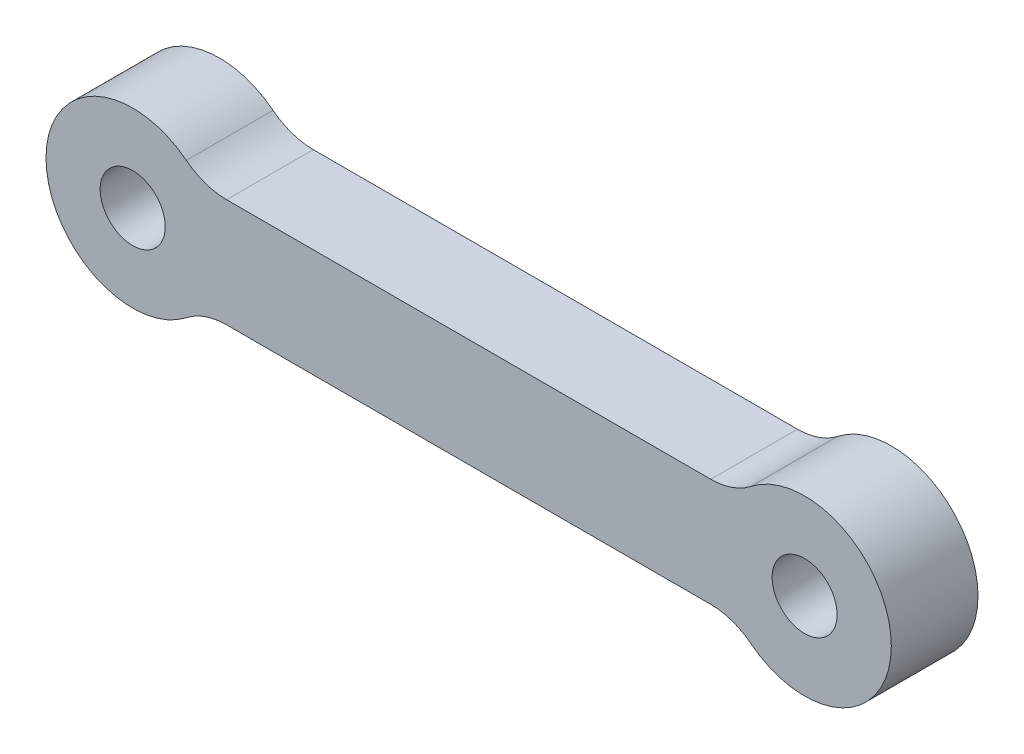
ISO-10303-21;
HEADER;
FILE_DESCRIPTION(('STEP AP214'),'2;1');
FILE_NAME('part.step','',(''),(''),'','','');
FILE_SCHEMA(('AUTOMOTIVE_DESIGN { 1 0 10303 214 1 1 1 1 }'));
ENDSEC;
DATA;
#1=APPLICATION_CONTEXT('core data for automotive mechanical design processes');
#2=APPLICATION_PROTOCOL_DEFINITION('international standard','automotive_design',2000,#1);
#3=PRODUCT_CONTEXT('',#1,'mechanical');
#4=PRODUCT('Part','Part','',(#3));
#5=PRODUCT_RELATED_PRODUCT_CATEGORY('part','',(#4));
#6=PRODUCT_DEFINITION_FORMATION('','',#4);
#7=PRODUCT_DEFINITION_CONTEXT('part definition',#1,'design');
#8=PRODUCT_DEFINITION('design','',#6,#7);
#9=PRODUCT_DEFINITION_SHAPE('','',#8);
#10=(LENGTH_UNIT() NAMED_UNIT(*) SI_UNIT(.MILLI.,.METRE.));
#11=(NAMED_UNIT(*) PLANE_ANGLE_UNIT() SI_UNIT($,.RADIAN.));
#12=(NAMED_UNIT(*) SI_UNIT($,.STERADIAN.) SOLID_ANGLE_UNIT());
#13=UNCERTAINTY_MEASURE_WITH_UNIT(LENGTH_MEASURE(1.E-05),#10,'distance_accuracy_value','');
#14=(GEOMETRIC_REPRESENTATION_CONTEXT(3) GLOBAL_UNCERTAINTY_ASSIGNED_CONTEXT((#13)) GLOBAL_UNIT_ASSIGNED_CONTEXT((#10,
#11,#12)) REPRESENTATION_CONTEXT('',''));
#15=CARTESIAN_POINT('',(0.,0.,0.));
#16=DIRECTION('',(0.,0.,1.));
#17=DIRECTION('',(1.,0.,0.));
#18=AXIS2_PLACEMENT_3D('',#15,#16,#17);
#19=CARTESIAN_POINT('',(11.1698729810778,5.5,4.));
#20=DIRECTION('',(0.,0.,1.));
#21=DIRECTION('',(1.,0.,0.));
#22=AXIS2_PLACEMENT_3D('',#19,#20,#21);
#23=PLANE('',#22);
#24=CARTESIAN_POINT('',(-15.5,0.,4.));
#25=DIRECTION('',(0.,0.,1.));
#26=DIRECTION('',(1.,0.,0.));
#27=AXIS2_PLACEMENT_3D('',#24,#25,#26);
#28=CIRCLE('',#27,1.5);
#29=CARTESIAN_POINT('',(-14.,0.,4.));
#30=VERTEX_POINT('',#29);
#31=EDGE_CURVE('E140',#30,#30,#28,.T.);
#32=ORIENTED_EDGE('',*,*,#31,.F.);
#33=EDGE_LOOP('',(#32));
#34=FACE_BOUND('',#33,.T.);
#35=CARTESIAN_POINT('',(11.1698729810778,5.5,4.));
#36=DIRECTION('',(0.,0.,-1.));
#37=DIRECTION('',(1.,0.,0.));
#38=AXIS2_PLACEMENT_3D('',#35,#36,#37);
#39=CIRCLE('',#38,3.);
#40=CARTESIAN_POINT('',(13.025641703473,3.14285714285714,4.));
#41=VERTEX_POINT('',#40);
#42=CARTESIAN_POINT('',(11.1698729810778,2.5,4.));
#43=VERTEX_POINT('',#42);
#44=EDGE_CURVE('E151',#41,#43,#39,.T.);
#45=ORIENTED_EDGE('',*,*,#44,.T.);
#46=DIRECTION('',(-1.,0.,0.));
#47=VECTOR('',#46,1.);
#48=CARTESIAN_POINT('',(-11.1698729810778,2.5,4.));
#49=LINE('',#48,#47);
#50=CARTESIAN_POINT('',(-11.1698729810778,2.5,4.));
#51=VERTEX_POINT('',#50);
#52=EDGE_CURVE('E99',#43,#51,#49,.T.);
#53=ORIENTED_EDGE('',*,*,#52,.T.);
#54=CARTESIAN_POINT('',(-11.1698729810778,5.5,4.));
#55=DIRECTION('',(0.,0.,-1.));
#56=DIRECTION('',(-1.,0.,0.));
#57=AXIS2_PLACEMENT_3D('',#54,#55,#56);
#58=CIRCLE('',#57,3.);
#59=CARTESIAN_POINT('',(-13.025641703473,3.14285714285714,4.));
#60=VERTEX_POINT('',#59);
#61=EDGE_CURVE('E166',#51,#60,#58,.T.);
#62=ORIENTED_EDGE('',*,*,#61,.T.);
#63=CARTESIAN_POINT('',(-15.5,0.,4.));
#64=DIRECTION('',(0.,0.,1.));
#65=DIRECTION('',(1.,0.,0.));
#66=AXIS2_PLACEMENT_3D('',#63,#64,#65);
#67=CIRCLE('',#66,4.);
#68=CARTESIAN_POINT('',(-13.025641703473,-3.14285714285714,4.));
#69=VERTEX_POINT('',#68);
#70=EDGE_CURVE('E179',#60,#69,#67,.T.);
#71=ORIENTED_EDGE('',*,*,#70,.T.);
#72=CARTESIAN_POINT('',(-11.1698729810778,-5.5,4.));
#73=DIRECTION('',(0.,0.,-1.));
#74=DIRECTION('',(-1.,0.,0.));
#75=AXIS2_PLACEMENT_3D('',#72,#73,#74);
#76=CIRCLE('',#75,3.);
#77=CARTESIAN_POINT('',(-11.1698729810778,-2.5,4.));
#78=VERTEX_POINT('',#77);
#79=EDGE_CURVE('E118',#69,#78,#76,.T.);
#80=ORIENTED_EDGE('',*,*,#79,.T.);
#81=DIRECTION('',(1.,0.,0.));
#82=VECTOR('',#81,1.);
#83=CARTESIAN_POINT('',(-11.1698729810778,-2.5,4.));
#84=LINE('',#83,#82);
#85=CARTESIAN_POINT('',(11.1698729810778,-2.5,4.));
#86=VERTEX_POINT('',#85);
#87=EDGE_CURVE('E112',#78,#86,#84,.T.);
#88=ORIENTED_EDGE('',*,*,#87,.T.);
#89=CARTESIAN_POINT('',(11.1698729810778,-5.5,4.));
#90=DIRECTION('',(0.,0.,-1.));
#91=DIRECTION('',(-1.,0.,0.));
#92=AXIS2_PLACEMENT_3D('',#89,#90,#91);
#93=CIRCLE('',#92,3.);
#94=CARTESIAN_POINT('',(13.025641703473,-3.14285714285714,4.));
#95=VERTEX_POINT('',#94);
#96=EDGE_CURVE('E116',#86,#95,#93,.T.);
#97=ORIENTED_EDGE('',*,*,#96,.T.);
#98=CARTESIAN_POINT('',(15.5,0.,4.));
#99=DIRECTION('',(0.,0.,1.));
#100=DIRECTION('',(-1.,0.,0.));
#101=AXIS2_PLACEMENT_3D('',#98,#99,#100);
#102=CIRCLE('',#101,4.);
#103=EDGE_CURVE('E56',#95,#41,#102,.T.);
#104=ORIENTED_EDGE('',*,*,#103,.T.);
#105=EDGE_LOOP('',(#45,#53,#62,#71,#80,#88,#97,#104));
#106=FACE_BOUND('',#105,.T.);
#107=CARTESIAN_POINT('',(15.5,0.,4.));
#108=DIRECTION('',(0.,0.,1.));
#109=DIRECTION('',(-1.,0.,0.));
#110=AXIS2_PLACEMENT_3D('',#107,#108,#109);
#111=CIRCLE('',#110,1.5);
#112=CARTESIAN_POINT('',(14.,0.,4.));
#113=VERTEX_POINT('',#112);
#114=EDGE_CURVE('E188',#113,#113,#111,.T.);
#115=ORIENTED_EDGE('',*,*,#114,.F.);
#116=EDGE_LOOP('',(#115));
#117=FACE_BOUND('',#116,.T.);
#118=ADVANCED_FACE('F39',(#34,#106,#117),#23,.T.);
#119=CARTESIAN_POINT('',(11.1698729810778,5.5,0.));
#120=DIRECTION('',(0.,0.,1.));
#121=DIRECTION('',(1.,0.,0.));
#122=AXIS2_PLACEMENT_3D('',#119,#120,#121);
#123=PLANE('',#122);
#124=CARTESIAN_POINT('',(11.1698729810778,5.5,0.));
#125=DIRECTION('',(0.,0.,-1.));
#126=DIRECTION('',(1.,0.,0.));
#127=AXIS2_PLACEMENT_3D('',#124,#125,#126);
#128=CIRCLE('',#127,3.);
#129=CARTESIAN_POINT('',(13.025641703473,3.14285714285714,0.));
#130=VERTEX_POINT('',#129);
#131=CARTESIAN_POINT('',(11.1698729810778,2.5,0.));
#132=VERTEX_POINT('',#131);
#133=EDGE_CURVE('E136',#130,#132,#128,.T.);
#134=ORIENTED_EDGE('',*,*,#133,.F.);
#135=CARTESIAN_POINT('',(15.5,0.,0.));
#136=DIRECTION('',(0.,0.,1.));
#137=DIRECTION('',(-1.,0.,0.));
#138=AXIS2_PLACEMENT_3D('',#135,#136,#137);
#139=CIRCLE('',#138,4.);
#140=CARTESIAN_POINT('',(13.025641703473,-3.14285714285714,0.));
#141=VERTEX_POINT('',#140);
#142=EDGE_CURVE('E91',#141,#130,#139,.T.);
#143=ORIENTED_EDGE('',*,*,#142,.F.);
#144=CARTESIAN_POINT('',(11.1698729810778,-5.5,0.));
#145=DIRECTION('',(0.,0.,-1.));
#146=DIRECTION('',(-1.,0.,0.));
#147=AXIS2_PLACEMENT_3D('',#144,#145,#146);
#148=CIRCLE('',#147,3.);
#149=CARTESIAN_POINT('',(11.1698729810778,-2.5,0.));
#150=VERTEX_POINT('',#149);
#151=EDGE_CURVE('E85',#150,#141,#148,.T.);
#152=ORIENTED_EDGE('',*,*,#151,.F.);
#153=DIRECTION('',(1.,0.,0.));
#154=VECTOR('',#153,1.);
#155=CARTESIAN_POINT('',(-11.1698729810778,-2.5,0.));
#156=LINE('',#155,#154);
#157=CARTESIAN_POINT('',(-11.1698729810778,-2.5,0.));
#158=VERTEX_POINT('',#157);
#159=EDGE_CURVE('E126',#158,#150,#156,.T.);
#160=ORIENTED_EDGE('',*,*,#159,.F.);
#161=CARTESIAN_POINT('',(-11.1698729810778,-5.5,0.));
#162=DIRECTION('',(0.,0.,-1.));
#163=DIRECTION('',(-1.,0.,0.));
#164=AXIS2_PLACEMENT_3D('',#161,#162,#163);
#165=CIRCLE('',#164,3.);
#166=CARTESIAN_POINT('',(-13.025641703473,-3.14285714285714,0.));
#167=VERTEX_POINT('',#166);
#168=EDGE_CURVE('E146',#167,#158,#165,.T.);
#169=ORIENTED_EDGE('',*,*,#168,.F.);
#170=CARTESIAN_POINT('',(-15.5,0.,0.));
#171=DIRECTION('',(0.,0.,1.));
#172=DIRECTION('',(1.,0.,0.));
#173=AXIS2_PLACEMENT_3D('',#170,#171,#172);
#174=CIRCLE('',#173,4.);
#175=CARTESIAN_POINT('',(-13.025641703473,3.14285714285714,0.));
#176=VERTEX_POINT('',#175);
#177=EDGE_CURVE('E144',#176,#167,#174,.T.);
#178=ORIENTED_EDGE('',*,*,#177,.F.);
#179=CARTESIAN_POINT('',(-11.1698729810778,5.5,0.));
#180=DIRECTION('',(0.,0.,-1.));
#181=DIRECTION('',(-1.,0.,0.));
#182=AXIS2_PLACEMENT_3D('',#179,#180,#181);
#183=CIRCLE('',#182,3.);
#184=CARTESIAN_POINT('',(-11.1698729810778,2.5,0.));
#185=VERTEX_POINT('',#184);
#186=EDGE_CURVE('E142',#185,#176,#183,.T.);
#187=ORIENTED_EDGE('',*,*,#186,.F.);
#188=DIRECTION('',(-1.,0.,0.));
#189=VECTOR('',#188,1.);
#190=CARTESIAN_POINT('',(-11.1698729810778,2.5,0.));
#191=LINE('',#190,#189);
#192=EDGE_CURVE('E139',#132,#185,#191,.T.);
#193=ORIENTED_EDGE('',*,*,#192,.F.);
#194=EDGE_LOOP('',(#134,#143,#152,#160,#169,#178,#187,#193));
#195=FACE_BOUND('',#194,.T.);
#196=CARTESIAN_POINT('',(-15.5,0.,0.));
#197=DIRECTION('',(0.,0.,1.));
#198=DIRECTION('',(1.,0.,0.));
#199=AXIS2_PLACEMENT_3D('',#196,#197,#198);
#200=CIRCLE('',#199,1.5);
#201=CARTESIAN_POINT('',(-14.,0.,0.));
#202=VERTEX_POINT('',#201);
#203=EDGE_CURVE('E185',#202,#202,#200,.T.);
#204=ORIENTED_EDGE('',*,*,#203,.T.);
#205=EDGE_LOOP('',(#204));
#206=FACE_BOUND('',#205,.T.);
#207=CARTESIAN_POINT('',(15.5,0.,0.));
#208=DIRECTION('',(0.,0.,1.));
#209=DIRECTION('',(-1.,0.,0.));
#210=AXIS2_PLACEMENT_3D('',#207,#208,#209);
#211=CIRCLE('',#210,1.5);
#212=CARTESIAN_POINT('',(14.,0.,0.));
#213=VERTEX_POINT('',#212);
#214=EDGE_CURVE('E191',#213,#213,#211,.T.);
#215=ORIENTED_EDGE('',*,*,#214,.T.);
#216=EDGE_LOOP('',(#215));
#217=FACE_BOUND('',#216,.T.);
#218=ADVANCED_FACE('F170',(#195,#206,#217),#123,.F.);
#219=CARTESIAN_POINT('',(11.1698729810778,5.5,4.));
#220=DIRECTION('',(0.,0.,-1.));
#221=DIRECTION('',(-1.,0.,0.));
#222=AXIS2_PLACEMENT_3D('',#219,#220,#221);
#223=CYLINDRICAL_SURFACE('',#222,3.);
#224=ORIENTED_EDGE('',*,*,#133,.T.);
#225=DIRECTION('',(0.,0.,-1.));
#226=VECTOR('',#225,1.);
#227=CARTESIAN_POINT('',(11.1698729810778,2.5,4.));
#228=LINE('',#227,#226);
#229=EDGE_CURVE('E11',#43,#132,#228,.T.);
#230=ORIENTED_EDGE('',*,*,#229,.F.);
#231=ORIENTED_EDGE('',*,*,#44,.F.);
#232=DIRECTION('',(0.,0.,-1.));
#233=VECTOR('',#232,1.);
#234=CARTESIAN_POINT('',(13.025641703473,3.14285714285714,4.));
#235=LINE('',#234,#233);
#236=EDGE_CURVE('E132',#41,#130,#235,.T.);
#237=ORIENTED_EDGE('',*,*,#236,.T.);
#238=EDGE_LOOP('',(#224,#230,#231,#237));
#239=FACE_BOUND('',#238,.T.);
#240=ADVANCED_FACE('F41',(#239),#223,.F.);
#241=CARTESIAN_POINT('',(-11.1698729810778,2.5,4.));
#242=DIRECTION('',(0.,-1.,0.));
#243=DIRECTION('',(0.,0.,-1.));
#244=AXIS2_PLACEMENT_3D('',#241,#242,#243);
#245=PLANE('',#244);
#246=ORIENTED_EDGE('',*,*,#192,.T.);
#247=DIRECTION('',(0.,0.,-1.));
#248=VECTOR('',#247,1.);
#249=CARTESIAN_POINT('',(-11.1698729810778,2.5,4.));
#250=LINE('',#249,#248);
#251=EDGE_CURVE('E48',#51,#185,#250,.T.);
#252=ORIENTED_EDGE('',*,*,#251,.F.);
#253=ORIENTED_EDGE('',*,*,#52,.F.);
#254=ORIENTED_EDGE('',*,*,#229,.T.);
#255=EDGE_LOOP('',(#246,#252,#253,#254));
#256=FACE_BOUND('',#255,.T.);
#257=ADVANCED_FACE('F223',(#256),#245,.F.);
#258=CARTESIAN_POINT('',(-11.1698729810778,5.5,4.));
#259=DIRECTION('',(0.,0.,-1.));
#260=DIRECTION('',(-1.,0.,0.));
#261=AXIS2_PLACEMENT_3D('',#258,#259,#260);
#262=CYLINDRICAL_SURFACE('',#261,3.);
#263=ORIENTED_EDGE('',*,*,#186,.T.);
#264=DIRECTION('',(0.,0.,-1.));
#265=VECTOR('',#264,1.);
#266=CARTESIAN_POINT('',(-13.025641703473,3.14285714285714,4.));
#267=LINE('',#266,#265);
#268=EDGE_CURVE('E158',#60,#176,#267,.T.);
#269=ORIENTED_EDGE('',*,*,#268,.F.);
#270=ORIENTED_EDGE('',*,*,#61,.F.);
#271=ORIENTED_EDGE('',*,*,#251,.T.);
#272=EDGE_LOOP('',(#263,#269,#270,#271));
#273=FACE_BOUND('',#272,.T.);
#274=ADVANCED_FACE('F164',(#273),#262,.F.);
#275=CARTESIAN_POINT('',(-15.5,0.,4.));
#276=DIRECTION('',(0.,0.,-1.));
#277=DIRECTION('',(-1.,0.,0.));
#278=AXIS2_PLACEMENT_3D('',#275,#276,#277);
#279=CYLINDRICAL_SURFACE('',#278,4.);
#280=ORIENTED_EDGE('',*,*,#177,.T.);
#281=DIRECTION('',(0.,0.,-1.));
#282=VECTOR('',#281,1.);
#283=CARTESIAN_POINT('',(-13.025641703473,-3.14285714285714,4.));
#284=LINE('',#283,#282);
#285=EDGE_CURVE('E155',#69,#167,#284,.T.);
#286=ORIENTED_EDGE('',*,*,#285,.F.);
#287=ORIENTED_EDGE('',*,*,#70,.F.);
#288=ORIENTED_EDGE('',*,*,#268,.T.);
#289=EDGE_LOOP('',(#280,#286,#287,#288));
#290=FACE_BOUND('',#289,.T.);
#291=ADVANCED_FACE('F175',(#290),#279,.T.);
#292=CARTESIAN_POINT('',(-11.1698729810778,-5.5,4.));
#293=DIRECTION('',(0.,0.,-1.));
#294=DIRECTION('',(-1.,0.,0.));
#295=AXIS2_PLACEMENT_3D('',#292,#293,#294);
#296=CYLINDRICAL_SURFACE('',#295,3.);
#297=ORIENTED_EDGE('',*,*,#168,.T.);
#298=DIRECTION('',(0.,0.,-1.));
#299=VECTOR('',#298,1.);
#300=CARTESIAN_POINT('',(-11.1698729810778,-2.5,4.));
#301=LINE('',#300,#299);
#302=EDGE_CURVE('E127',#78,#158,#301,.T.);
#303=ORIENTED_EDGE('',*,*,#302,.F.);
#304=ORIENTED_EDGE('',*,*,#79,.F.);
#305=ORIENTED_EDGE('',*,*,#285,.T.);
#306=EDGE_LOOP('',(#297,#303,#304,#305));
#307=FACE_BOUND('',#306,.T.);
#308=ADVANCED_FACE('F178',(#307),#296,.F.);
#309=CARTESIAN_POINT('',(-11.1698729810778,-2.5,4.));
#310=DIRECTION('',(0.,1.,0.));
#311=DIRECTION('',(0.,0.,1.));
#312=AXIS2_PLACEMENT_3D('',#309,#310,#311);
#313=PLANE('',#312);
#314=ORIENTED_EDGE('',*,*,#159,.T.);
#315=DIRECTION('',(0.,0.,-1.));
#316=VECTOR('',#315,1.);
#317=CARTESIAN_POINT('',(11.1698729810778,-2.5,4.));
#318=LINE('',#317,#316);
#319=EDGE_CURVE('E123',#86,#150,#318,.T.);
#320=ORIENTED_EDGE('',*,*,#319,.F.);
#321=ORIENTED_EDGE('',*,*,#87,.F.);
#322=ORIENTED_EDGE('',*,*,#302,.T.);
#323=EDGE_LOOP('',(#314,#320,#321,#322));
#324=FACE_BOUND('',#323,.T.);
#325=ADVANCED_FACE('F124',(#324),#313,.F.);
#326=CARTESIAN_POINT('',(11.1698729810778,-5.5,4.));
#327=DIRECTION('',(0.,0.,-1.));
#328=DIRECTION('',(-1.,0.,0.));
#329=AXIS2_PLACEMENT_3D('',#326,#327,#328);
#330=CYLINDRICAL_SURFACE('',#329,3.);
#331=ORIENTED_EDGE('',*,*,#151,.T.);
#332=DIRECTION('',(0.,0.,-1.));
#333=VECTOR('',#332,1.);
#334=CARTESIAN_POINT('',(13.025641703473,-3.14285714285714,4.));
#335=LINE('',#334,#333);
#336=EDGE_CURVE('E128',#95,#141,#335,.T.);
#337=ORIENTED_EDGE('',*,*,#336,.F.);
#338=ORIENTED_EDGE('',*,*,#96,.F.);
#339=ORIENTED_EDGE('',*,*,#319,.T.);
#340=EDGE_LOOP('',(#331,#337,#338,#339));
#341=FACE_BOUND('',#340,.T.);
#342=ADVANCED_FACE('F130',(#341),#330,.F.);
#343=CARTESIAN_POINT('',(15.5,0.,4.));
#344=DIRECTION('',(0.,0.,-1.));
#345=DIRECTION('',(-1.,0.,0.));
#346=AXIS2_PLACEMENT_3D('',#343,#344,#345);
#347=CYLINDRICAL_SURFACE('',#346,4.);
#348=ORIENTED_EDGE('',*,*,#142,.T.);
#349=ORIENTED_EDGE('',*,*,#236,.F.);
#350=ORIENTED_EDGE('',*,*,#103,.F.);
#351=ORIENTED_EDGE('',*,*,#336,.T.);
#352=EDGE_LOOP('',(#348,#349,#350,#351));
#353=FACE_BOUND('',#352,.T.);
#354=ADVANCED_FACE('F211',(#353),#347,.T.);
#355=CARTESIAN_POINT('',(-15.5,0.,4.));
#356=DIRECTION('',(0.,0.,-1.));
#357=DIRECTION('',(-1.,0.,0.));
#358=AXIS2_PLACEMENT_3D('',#355,#356,#357);
#359=CYLINDRICAL_SURFACE('',#358,1.5);
#360=ORIENTED_EDGE('',*,*,#31,.T.);
#361=EDGE_LOOP('',(#360));
#362=FACE_BOUND('',#361,.T.);
#363=ORIENTED_EDGE('',*,*,#203,.F.);
#364=EDGE_LOOP('',(#363));
#365=FACE_BOUND('',#364,.T.);
#366=ADVANCED_FACE('F208',(#362,#365),#359,.F.);
#367=CARTESIAN_POINT('',(15.5,0.,4.));
#368=DIRECTION('',(0.,0.,-1.));
#369=DIRECTION('',(-1.,0.,0.));
#370=AXIS2_PLACEMENT_3D('',#367,#368,#369);
#371=CYLINDRICAL_SURFACE('',#370,1.5);
#372=ORIENTED_EDGE('',*,*,#114,.T.);
#373=EDGE_LOOP('',(#372));
#374=FACE_BOUND('',#373,.T.);
#375=ORIENTED_EDGE('',*,*,#214,.F.);
#376=EDGE_LOOP('',(#375));
#377=FACE_BOUND('',#376,.T.);
#378=ADVANCED_FACE('F197',(#374,#377),#371,.F.);
#379=CLOSED_SHELL('',(#118,#218,#240,#257,#274,#291,#308,#325,#342,#354,#366,#378));
#380=MANIFOLD_SOLID_BREP('B2',#379);
#381=ADVANCED_BREP_SHAPE_REPRESENTATION('',(#18,#380),#14);
#382=SHAPE_DEFINITION_REPRESENTATION(#9,#381);
ENDSEC;
END-ISO-10303-21;
